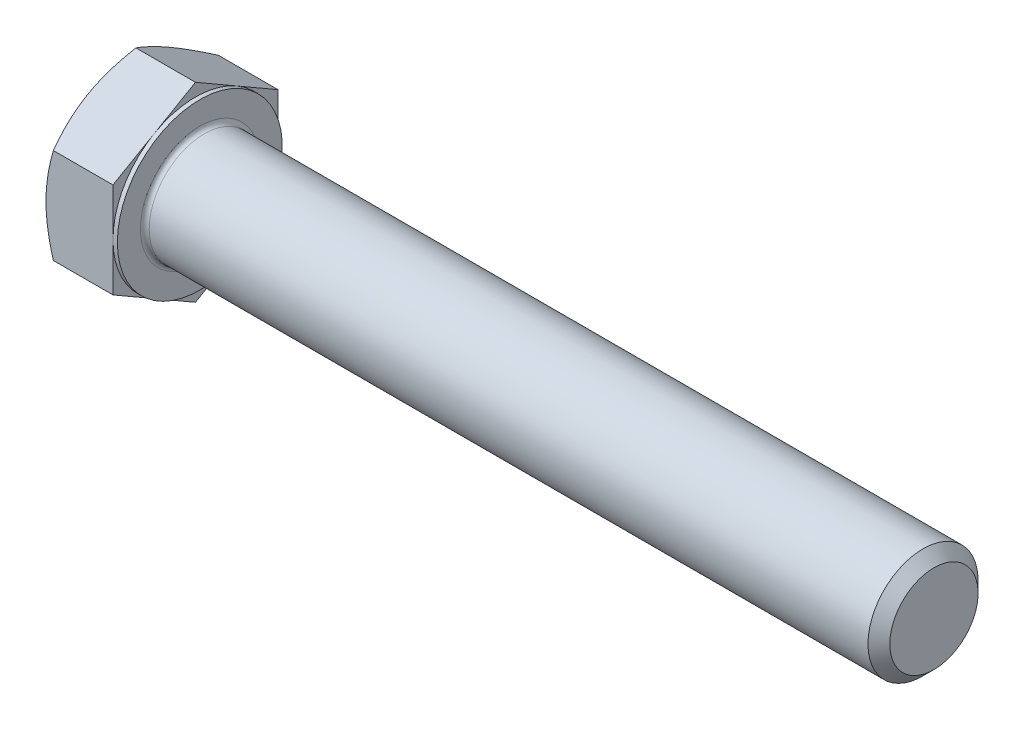
ISO-10303-21;
HEADER;
FILE_DESCRIPTION(('STEP AP214'),'2;1');
FILE_NAME('part.step','',(''),(''),'','','');
FILE_SCHEMA(('AUTOMOTIVE_DESIGN { 1 0 10303 214 1 1 1 1 }'));
ENDSEC;
DATA;
#1=APPLICATION_CONTEXT('core data for automotive mechanical design processes');
#2=APPLICATION_PROTOCOL_DEFINITION('international standard','automotive_design',2000,#1);
#3=PRODUCT_CONTEXT('',#1,'mechanical');
#4=PRODUCT('Part','Part','',(#3));
#5=PRODUCT_RELATED_PRODUCT_CATEGORY('part','',(#4));
#6=PRODUCT_DEFINITION_FORMATION('','',#4);
#7=PRODUCT_DEFINITION_CONTEXT('part definition',#1,'design');
#8=PRODUCT_DEFINITION('design','',#6,#7);
#9=PRODUCT_DEFINITION_SHAPE('','',#8);
#10=(LENGTH_UNIT() NAMED_UNIT(*) SI_UNIT(.MILLI.,.METRE.));
#11=(NAMED_UNIT(*) PLANE_ANGLE_UNIT() SI_UNIT($,.RADIAN.));
#12=(NAMED_UNIT(*) SI_UNIT($,.STERADIAN.) SOLID_ANGLE_UNIT());
#13=UNCERTAINTY_MEASURE_WITH_UNIT(LENGTH_MEASURE(1.E-05),#10,'distance_accuracy_value','');
#14=(GEOMETRIC_REPRESENTATION_CONTEXT(3) GLOBAL_UNCERTAINTY_ASSIGNED_CONTEXT((#13)) GLOBAL_UNIT_ASSIGNED_CONTEXT((#10,
#11,#12)) REPRESENTATION_CONTEXT('',''));
#15=CARTESIAN_POINT('',(0.,0.,0.));
#16=DIRECTION('',(0.,0.,1.));
#17=DIRECTION('',(1.,0.,0.));
#18=AXIS2_PLACEMENT_3D('',#15,#16,#17);
#19=CARTESIAN_POINT('',(0.,8.24155962262808,0.));
#20=DIRECTION('',(1.,0.,0.));
#21=DIRECTION('',(0.,0.,-1.));
#22=AXIS2_PLACEMENT_3D('',#19,#20,#21);
#23=PLANE('',#22);
#24=CARTESIAN_POINT('',(0.,0.,0.));
#25=DIRECTION('',(1.,0.,0.));
#26=DIRECTION('',(0.,1.,0.));
#27=AXIS2_PLACEMENT_3D('',#24,#25,#26);
#28=CIRCLE('',#27,7.1374);
#29=CARTESIAN_POINT('',(0.,-6.18116971697105,-3.56870000000001));
#30=VERTEX_POINT('',#29);
#31=CARTESIAN_POINT('',(0.,0.,-7.1374));
#32=VERTEX_POINT('',#31);
#33=EDGE_CURVE('E111',#30,#32,#28,.T.);
#34=ORIENTED_EDGE('',*,*,#33,.F.);
#35=CARTESIAN_POINT('',(0.,0.,0.));
#36=DIRECTION('',(1.,0.,0.));
#37=DIRECTION('',(0.,0.,-1.));
#38=AXIS2_PLACEMENT_3D('',#35,#36,#37);
#39=CIRCLE('',#38,7.1374);
#40=CARTESIAN_POINT('',(0.,-6.18116971697106,3.56870000000001));
#41=VERTEX_POINT('',#40);
#42=EDGE_CURVE('E108',#41,#30,#39,.T.);
#43=ORIENTED_EDGE('',*,*,#42,.F.);
#44=CARTESIAN_POINT('',(0.,0.,0.));
#45=DIRECTION('',(1.,0.,0.));
#46=DIRECTION('',(0.,0.,-1.));
#47=AXIS2_PLACEMENT_3D('',#44,#45,#46);
#48=CIRCLE('',#47,7.1374);
#49=CARTESIAN_POINT('',(0.,0.,7.1374));
#50=VERTEX_POINT('',#49);
#51=EDGE_CURVE('E423',#50,#41,#48,.T.);
#52=ORIENTED_EDGE('',*,*,#51,.F.);
#53=CARTESIAN_POINT('',(0.,0.,0.));
#54=DIRECTION('',(1.,0.,0.));
#55=DIRECTION('',(0.,0.,-1.));
#56=AXIS2_PLACEMENT_3D('',#53,#54,#55);
#57=CIRCLE('',#56,7.1374);
#58=CARTESIAN_POINT('',(0.,6.18116971697105,3.56870000000001));
#59=VERTEX_POINT('',#58);
#60=EDGE_CURVE('E169',#59,#50,#57,.T.);
#61=ORIENTED_EDGE('',*,*,#60,.F.);
#62=CARTESIAN_POINT('',(0.,0.,0.));
#63=DIRECTION('',(1.,0.,0.));
#64=DIRECTION('',(0.,0.,-1.));
#65=AXIS2_PLACEMENT_3D('',#62,#63,#64);
#66=CIRCLE('',#65,7.1374);
#67=CARTESIAN_POINT('',(0.,6.18116971697105,-3.56870000000001));
#68=VERTEX_POINT('',#67);
#69=EDGE_CURVE('E421',#68,#59,#66,.T.);
#70=ORIENTED_EDGE('',*,*,#69,.F.);
#71=CARTESIAN_POINT('',(0.,0.,0.));
#72=DIRECTION('',(1.,0.,0.));
#73=DIRECTION('',(0.,0.,-1.));
#74=AXIS2_PLACEMENT_3D('',#71,#72,#73);
#75=CIRCLE('',#74,7.1374);
#76=EDGE_CURVE('E114',#32,#68,#75,.T.);
#77=ORIENTED_EDGE('',*,*,#76,.F.);
#78=EDGE_LOOP('',(#34,#43,#52,#61,#70,#77));
#79=FACE_BOUND('',#78,.T.);
#80=ADVANCED_FACE('F14',(#79),#23,.F.);
#81=CARTESIAN_POINT('',(0.641311776484759,0.,0.));
#82=DIRECTION('',(1.,0.,0.));
#83=DIRECTION('',(0.,0.,-1.));
#84=AXIS2_PLACEMENT_3D('',#81,#82,#83);
#85=CONICAL_SURFACE('',#84,8.24818458036387,1.0471975511966);
#86=ORIENTED_EDGE('',*,*,#42,.T.);
#87=CARTESIAN_POINT('',(0.,-6.18116971697106,-3.56870000000002));
#88=CARTESIAN_POINT('',(-2.91702878282993E-05,-6.26862170985652,-3.41722870509925));
#89=CARTESIAN_POINT('',(0.00371114889844023,-6.35606948988297,-3.26576470708432));
#90=CARTESIAN_POINT('',(0.0185139577467834,-6.53079334497843,-2.9631341127647));
#91=CARTESIAN_POINT('',(0.0295749978503087,-6.61806945060963,-2.81196746352471));
#92=CARTESIAN_POINT('',(0.0587296036169502,-6.7918862225359,-2.5109079833408));
#93=CARTESIAN_POINT('',(0.0767877659737069,-6.87842838481195,-2.3610125612818));
#94=CARTESIAN_POINT('',(0.119548178265527,-7.05110039256495,-2.06193587080869));
#95=CARTESIAN_POINT('',(0.144250603082629,-7.13723022712836,-1.91275462129736));
#96=CARTESIAN_POINT('',(0.227561148311191,-7.39464422393007,-1.46690050025742));
#97=CARTESIAN_POINT('',(0.295412992760171,-7.56518058886256,-1.17152285165624));
#98=CARTESIAN_POINT('',(0.4518967007908,-7.90478678087675,-0.583307672522675));
#99=CARTESIAN_POINT('',(0.540632343376948,-8.07384476218822,-0.29049065946618));
#100=CARTESIAN_POINT('',(0.637486855352643,-8.2415596226281,0.));
#101=B_SPLINE_CURVE_WITH_KNOTS('',3,(#87,#88,#89,#90,#91,#92,#93,#94,#95,#96,#97,#98,#99,#100),
.UNSPECIFIED.,.F.,.F.,(4,2,2,2,2,2,4),(0.,0.524658409500519,1.04921296370403,1.5711473776056,
2.09309553056225,3.13562382142666,4.18344647054619),.UNSPECIFIED.);
#102=CARTESIAN_POINT('',(0.637486855352642,-8.2415596226281,0.));
#103=VERTEX_POINT('',#102);
#104=EDGE_CURVE('E126',#30,#103,#101,.T.);
#105=ORIENTED_EDGE('',*,*,#104,.T.);
#106=CARTESIAN_POINT('',(0.637486855352642,-8.2415596226281,0.));
#107=CARTESIAN_POINT('',(0.540632343376948,-8.07384476218822,0.290490659466181));
#108=CARTESIAN_POINT('',(0.451896700790801,-7.90478678087675,0.583307672522676));
#109=CARTESIAN_POINT('',(0.295412992760172,-7.56518058886257,1.17152285165624));
#110=CARTESIAN_POINT('',(0.227561148311191,-7.39464422393008,1.46690050025742));
#111=CARTESIAN_POINT('',(0.144250603082631,-7.13723022712836,1.91275462129736));
#112=CARTESIAN_POINT('',(0.119548178265529,-7.05110039256495,2.06193587080869));
#113=CARTESIAN_POINT('',(0.0767877659737091,-6.87842838481196,2.3610125612818));
#114=CARTESIAN_POINT('',(0.058729603616952,-6.7918862225359,2.5109079833408));
#115=CARTESIAN_POINT('',(0.0295749978503105,-6.61806945060963,2.81196746352471));
#116=CARTESIAN_POINT('',(0.0185139577467857,-6.53079334497843,2.9631341127647));
#117=CARTESIAN_POINT('',(0.00371114889844332,-6.35606948988298,3.26576470708432));
#118=CARTESIAN_POINT('',(-2.91702878249864E-05,-6.26862170985652,3.41722870509925));
#119=CARTESIAN_POINT('',(0.,-6.18116971697107,3.56870000000002));
#120=B_SPLINE_CURVE_WITH_KNOTS('',3,(#106,#107,#108,#109,#110,#111,#112,#113,#114,#115,#116,
#117,#118,#119),.UNSPECIFIED.,.F.,.F.,(4,2,2,2,2,2,4),(0.,1.04782264911953,2.09035093998394,
2.61229909294058,3.13423350684215,3.65878806104566,4.18344647054618),.UNSPECIFIED.);
#121=EDGE_CURVE('E132',#103,#41,#120,.T.);
#122=ORIENTED_EDGE('',*,*,#121,.T.);
#123=EDGE_LOOP('',(#86,#105,#122));
#124=FACE_BOUND('',#123,.T.);
#125=ADVANCED_FACE('F130',(#124),#85,.T.);
#126=CARTESIAN_POINT('',(0.641311776484747,0.,0.));
#127=DIRECTION('',(1.,0.,0.));
#128=DIRECTION('',(0.,1.,0.));
#129=AXIS2_PLACEMENT_3D('',#126,#127,#128);
#130=CONICAL_SURFACE('',#129,8.24818458036384,1.0471975511966);
#131=ORIENTED_EDGE('',*,*,#33,.T.);
#132=CARTESIAN_POINT('',(0.,0.,-7.1374));
#133=CARTESIAN_POINT('',(-2.91702878361616E-05,-0.174903985770917,-7.1374));
#134=CARTESIAN_POINT('',(0.00371114889843225,-0.349799545823828,-7.1374));
#135=CARTESIAN_POINT('',(0.0185139577467751,-0.699247256014727,-7.1374));
#136=CARTESIAN_POINT('',(0.0295749978503003,-0.873799467277128,-7.1374));
#137=CARTESIAN_POINT('',(0.0587296036169421,-1.22143301112966,-7.1374));
#138=CARTESIAN_POINT('',(0.0767877659736991,-1.39451733568178,-7.1374));
#139=CARTESIAN_POINT('',(0.119548178265519,-1.73986135118776,-7.1374));
#140=CARTESIAN_POINT('',(0.144250603082621,-1.91212102031459,-7.1374));
#141=CARTESIAN_POINT('',(0.227561148311181,-2.42694901391801,-7.1374));
#142=CARTESIAN_POINT('',(0.295412992760161,-2.76802174378299,-7.1374));
#143=CARTESIAN_POINT('',(0.45189670079079,-3.44723412781136,-7.1374));
#144=CARTESIAN_POINT('',(0.540632343376937,-3.7853500904343,-7.1374));
#145=CARTESIAN_POINT('',(0.637486855352632,-4.12077981131404,-7.1374));
#146=B_SPLINE_CURVE_WITH_KNOTS('',3,(#132,#133,#134,#135,#136,#137,#138,#139,#140,#141,#142,
#143,#144,#145),.UNSPECIFIED.,.F.,.F.,(4,2,2,2,2,2,4),(0.,0.524658409500517,1.04921296370403,
1.5711473776056,2.09309553056224,3.13562382142665,4.18344647054617),.UNSPECIFIED.);
#147=CARTESIAN_POINT('',(0.637486855352631,-4.12077981131404,-7.1374));
#148=VERTEX_POINT('',#147);
#149=EDGE_CURVE('E122',#32,#148,#146,.T.);
#150=ORIENTED_EDGE('',*,*,#149,.T.);
#151=CARTESIAN_POINT('',(0.637486855352631,-4.12077981131404,-7.1374));
#152=CARTESIAN_POINT('',(0.540632343376938,-4.28849467175391,-6.84690934053382));
#153=CARTESIAN_POINT('',(0.451896700790792,-4.45755265306538,-6.55409232747733));
#154=CARTESIAN_POINT('',(0.295412992760165,-4.79715884507957,-5.96587714834377));
#155=CARTESIAN_POINT('',(0.227561148311186,-4.96769521001206,-5.6704994997426));
#156=CARTESIAN_POINT('',(0.144250603082627,-5.22510920681377,-5.22464537870266));
#157=CARTESIAN_POINT('',(0.119548178265525,-5.31123904137718,-5.07546412919133));
#158=CARTESIAN_POINT('',(0.0767877659737055,-5.48391104913017,-4.77638743871822));
#159=CARTESIAN_POINT('',(0.0587296036169486,-5.57045321140623,-4.62649201665922));
#160=CARTESIAN_POINT('',(0.0295749978503076,-5.7442699833325,-4.32543253647531));
#161=CARTESIAN_POINT('',(0.0185139577467831,-5.8315460889637,-4.17426588723533));
#162=CARTESIAN_POINT('',(0.00371114889844103,-6.00626994405915,-3.87163529291571));
#163=CARTESIAN_POINT('',(-2.9170287827248E-05,-6.0937177240856,-3.72017129490078));
#164=CARTESIAN_POINT('',(0.,-6.18116971697106,-3.56870000000002));
#165=B_SPLINE_CURVE_WITH_KNOTS('',3,(#151,#152,#153,#154,#155,#156,#157,#158,#159,#160,#161,
#162,#163,#164),.UNSPECIFIED.,.F.,.F.,(4,2,2,2,2,2,4),(0.,1.04782264911952,2.09035093998392,
2.61229909294056,3.13423350684213,3.65878806104563,4.18344647054615),.UNSPECIFIED.);
#166=EDGE_CURVE('E120',#148,#30,#165,.T.);
#167=ORIENTED_EDGE('',*,*,#166,.T.);
#168=EDGE_LOOP('',(#131,#150,#167));
#169=FACE_BOUND('',#168,.T.);
#170=ADVANCED_FACE('F121',(#169),#130,.T.);
#171=CARTESIAN_POINT('',(0.641311776484744,0.,0.));
#172=DIRECTION('',(1.,0.,0.));
#173=DIRECTION('',(0.,0.,-1.));
#174=AXIS2_PLACEMENT_3D('',#171,#172,#173);
#175=CONICAL_SURFACE('',#174,8.24818458036384,1.0471975511966);
#176=CARTESIAN_POINT('',(0.637486855352629,4.12077981131404,-7.1374));
#177=CARTESIAN_POINT('',(0.540632343376935,3.7853500904343,-7.1374));
#178=CARTESIAN_POINT('',(0.451896700790788,3.44723412781136,-7.1374));
#179=CARTESIAN_POINT('',(0.29541299276016,2.76802174378299,-7.1374));
#180=CARTESIAN_POINT('',(0.22756114831118,2.42694901391801,-7.1374));
#181=CARTESIAN_POINT('',(0.14425060308262,1.91212102031458,-7.1374));
#182=CARTESIAN_POINT('',(0.119548178265518,1.73986135118776,-7.1374));
#183=CARTESIAN_POINT('',(0.0767877659736987,1.39451733568178,-7.1374));
#184=CARTESIAN_POINT('',(0.0587296036169421,1.22143301112966,-7.1374));
#185=CARTESIAN_POINT('',(0.0295749978503006,0.873799467277128,-7.1374));
#186=CARTESIAN_POINT('',(0.0185139577467753,0.699247256014728,-7.1374));
#187=CARTESIAN_POINT('',(0.00371114889843236,0.34979954582383,-7.1374));
#188=CARTESIAN_POINT('',(-2.91702878360451E-05,0.174903985770919,-7.1374));
#189=CARTESIAN_POINT('',(0.,0.,-7.1374));
#190=B_SPLINE_CURVE_WITH_KNOTS('',3,(#176,#177,#178,#179,#180,#181,#182,#183,#184,#185,#186,
#187,#188,#189),.UNSPECIFIED.,.F.,.F.,(4,2,2,2,2,2,4),(0.,1.04782264911952,2.09035093998393,
2.61229909294057,3.13423350684214,3.65878806104565,4.18344647054616),.UNSPECIFIED.);
#191=CARTESIAN_POINT('',(0.637486855352629,4.12077981131404,-7.1374));
#192=VERTEX_POINT('',#191);
#193=EDGE_CURVE('E140',#192,#32,#190,.T.);
#194=ORIENTED_EDGE('',*,*,#193,.T.);
#195=ORIENTED_EDGE('',*,*,#76,.T.);
#196=CARTESIAN_POINT('',(0.,6.18116971697105,-3.56870000000001));
#197=CARTESIAN_POINT('',(-2.91702878326612E-05,6.0937177240856,-3.72017129490077));
#198=CARTESIAN_POINT('',(0.0037111488984358,6.00626994405914,-3.8716352929157));
#199=CARTESIAN_POINT('',(0.0185139577467784,5.83154608896369,-4.17426588723532));
#200=CARTESIAN_POINT('',(0.0295749978503032,5.74426998333249,-4.32543253647531));
#201=CARTESIAN_POINT('',(0.0587296036169441,5.57045321140622,-4.62649201665922));
#202=CARTESIAN_POINT('',(0.0767877659737007,5.48391104913017,-4.77638743871822));
#203=CARTESIAN_POINT('',(0.11954817826552,5.31123904137718,-5.07546412919132));
#204=CARTESIAN_POINT('',(0.144250603082622,5.22510920681376,-5.22464537870265));
#205=CARTESIAN_POINT('',(0.227561148311182,4.96769521001205,-5.67049949974259));
#206=CARTESIAN_POINT('',(0.295412992760161,4.79715884507956,-5.96587714834377));
#207=CARTESIAN_POINT('',(0.451896700790789,4.45755265306538,-6.55409232747733));
#208=CARTESIAN_POINT('',(0.540632343376935,4.28849467175391,-6.84690934053382));
#209=CARTESIAN_POINT('',(0.637486855352629,4.12077981131404,-7.1374));
#210=B_SPLINE_CURVE_WITH_KNOTS('',3,(#196,#197,#198,#199,#200,#201,#202,#203,#204,#205,#206,
#207,#208,#209),.UNSPECIFIED.,.F.,.F.,(4,2,2,2,2,2,4),(0.,0.524658409500514,1.04921296370402,
1.57114737760559,2.09309553056223,3.13562382142663,4.18344647054615),.UNSPECIFIED.);
#211=EDGE_CURVE('E246',#68,#192,#210,.T.);
#212=ORIENTED_EDGE('',*,*,#211,.T.);
#213=EDGE_LOOP('',(#194,#195,#212));
#214=FACE_BOUND('',#213,.T.);
#215=ADVANCED_FACE('F236',(#214),#175,.T.);
#216=CARTESIAN_POINT('',(0.64131177648475,0.,0.));
#217=DIRECTION('',(1.,0.,0.));
#218=DIRECTION('',(0.,0.,-1.));
#219=AXIS2_PLACEMENT_3D('',#216,#217,#218);
#220=CONICAL_SURFACE('',#219,8.24818458036385,1.0471975511966);
#221=CARTESIAN_POINT('',(0.637486855352634,8.24155962262808,0.));
#222=CARTESIAN_POINT('',(0.54063234337694,8.07384476218821,-0.290490659466181));
#223=CARTESIAN_POINT('',(0.451896700790793,7.90478678087674,-0.583307672522675));
#224=CARTESIAN_POINT('',(0.295412992760164,7.56518058886255,-1.17152285165624));
#225=CARTESIAN_POINT('',(0.227561148311184,7.39464422393006,-1.46690050025742));
#226=CARTESIAN_POINT('',(0.144250603082623,7.13723022712835,-1.91275462129736));
#227=CARTESIAN_POINT('',(0.119548178265522,7.05110039256494,-2.06193587080869));
#228=CARTESIAN_POINT('',(0.0767877659737015,6.87842838481195,-2.3610125612818));
#229=CARTESIAN_POINT('',(0.0587296036169445,6.79188622253589,-2.5109079833408));
#230=CARTESIAN_POINT('',(0.029574997850303,6.61806945060962,-2.81196746352471));
#231=CARTESIAN_POINT('',(0.0185139577467781,6.53079334497842,-2.96313411276469));
#232=CARTESIAN_POINT('',(0.0037111488984355,6.35606948988297,-3.26576470708431));
#233=CARTESIAN_POINT('',(-2.91702878328936E-05,6.26862170985651,-3.41722870509924));
#234=CARTESIAN_POINT('',(0.,6.18116971697105,-3.56870000000001));
#235=B_SPLINE_CURVE_WITH_KNOTS('',3,(#221,#222,#223,#224,#225,#226,#227,#228,#229,#230,#231,
#232,#233,#234),.UNSPECIFIED.,.F.,.F.,(4,2,2,2,2,2,4),(0.,1.04782264911953,2.09035093998393,
2.61229909294057,3.13423350684215,3.65878806104566,4.18344647054617),.UNSPECIFIED.);
#236=CARTESIAN_POINT('',(0.637486855352634,8.24155962262808,0.));
#237=VERTEX_POINT('',#236);
#238=EDGE_CURVE('E241',#237,#68,#235,.T.);
#239=ORIENTED_EDGE('',*,*,#238,.T.);
#240=ORIENTED_EDGE('',*,*,#69,.T.);
#241=CARTESIAN_POINT('',(0.,6.18116971697105,3.56870000000001));
#242=CARTESIAN_POINT('',(-2.91702878348035E-05,6.26862170985651,3.41722870509924));
#243=CARTESIAN_POINT('',(0.00371114889843366,6.35606948988296,3.26576470708432));
#244=CARTESIAN_POINT('',(0.0185139577467761,6.53079334497841,2.9631341127647));
#245=CARTESIAN_POINT('',(0.0295749978503009,6.61806945060961,2.81196746352471));
#246=CARTESIAN_POINT('',(0.0587296036169423,6.79188622253588,2.5109079833408));
#247=CARTESIAN_POINT('',(0.0767877659736994,6.87842838481194,2.3610125612818));
#248=CARTESIAN_POINT('',(0.11954817826552,7.05110039256493,2.06193587080869));
#249=CARTESIAN_POINT('',(0.144250603082622,7.13723022712835,1.91275462129736));
#250=CARTESIAN_POINT('',(0.227561148311182,7.39464422393006,1.46690050025742));
#251=CARTESIAN_POINT('',(0.295412992760163,7.56518058886255,1.17152285165624));
#252=CARTESIAN_POINT('',(0.451896700790792,7.90478678087674,0.583307672522675));
#253=CARTESIAN_POINT('',(0.540632343376939,8.07384476218821,0.290490659466181));
#254=CARTESIAN_POINT('',(0.637486855352634,8.24155962262808,0.));
#255=B_SPLINE_CURVE_WITH_KNOTS('',3,(#241,#242,#243,#244,#245,#246,#247,#248,#249,#250,#251,
#252,#253,#254),.UNSPECIFIED.,.F.,.F.,(4,2,2,2,2,2,4),(0.,0.524658409500519,1.04921296370403,
1.5711473776056,2.09309553056224,3.13562382142665,4.18344647054618),.UNSPECIFIED.);
#256=EDGE_CURVE('E228',#59,#237,#255,.T.);
#257=ORIENTED_EDGE('',*,*,#256,.T.);
#258=EDGE_LOOP('',(#239,#240,#257));
#259=FACE_BOUND('',#258,.T.);
#260=ADVANCED_FACE('F233',(#259),#220,.T.);
#261=CARTESIAN_POINT('',(0.64131177648475,0.,0.));
#262=DIRECTION('',(1.,0.,0.));
#263=DIRECTION('',(0.,0.,-1.));
#264=AXIS2_PLACEMENT_3D('',#261,#262,#263);
#265=CONICAL_SURFACE('',#264,8.24818458036385,1.0471975511966);
#266=ORIENTED_EDGE('',*,*,#51,.T.);
#267=CARTESIAN_POINT('',(0.,-6.18116971697107,3.56870000000002));
#268=CARTESIAN_POINT('',(-2.91702878254666E-05,-6.09371772408561,3.72017129490078));
#269=CARTESIAN_POINT('',(0.00371114889844298,-6.00626994405915,3.87163529291571));
#270=CARTESIAN_POINT('',(0.0185139577467857,-5.8315460889637,4.17426588723533));
#271=CARTESIAN_POINT('',(0.0295749978503107,-5.7442699833325,4.32543253647531));
#272=CARTESIAN_POINT('',(0.0587296036169519,-5.57045321140624,4.62649201665922));
#273=CARTESIAN_POINT('',(0.0767877659737084,-5.48391104913018,4.77638743871822));
#274=CARTESIAN_POINT('',(0.119548178265528,-5.31123904137719,5.07546412919133));
#275=CARTESIAN_POINT('',(0.144250603082629,-5.22510920681378,5.22464537870266));
#276=CARTESIAN_POINT('',(0.227561148311189,-4.96769521001206,5.6704994997426));
#277=CARTESIAN_POINT('',(0.295412992760168,-4.79715884507957,5.96587714834377));
#278=CARTESIAN_POINT('',(0.451896700790795,-4.45755265306539,6.55409232747733));
#279=CARTESIAN_POINT('',(0.54063234337694,-4.28849467175392,6.84690934053382));
#280=CARTESIAN_POINT('',(0.637486855352634,-4.12077981131405,7.1374));
#281=B_SPLINE_CURVE_WITH_KNOTS('',3,(#267,#268,#269,#270,#271,#272,#273,#274,#275,#276,#277,
#278,#279,#280),.UNSPECIFIED.,.F.,.F.,(4,2,2,2,2,2,4),(0.,0.524658409500513,1.04921296370402,
1.57114737760559,2.09309553056223,3.13562382142663,4.18344647054615),.UNSPECIFIED.);
#282=CARTESIAN_POINT('',(0.637486855352634,-4.12077981131405,7.1374));
#283=VERTEX_POINT('',#282);
#284=EDGE_CURVE('E127',#41,#283,#281,.T.);
#285=ORIENTED_EDGE('',*,*,#284,.T.);
#286=CARTESIAN_POINT('',(0.637486855352634,-4.12077981131405,7.1374));
#287=CARTESIAN_POINT('',(0.540632343376939,-3.78535009043431,7.1374));
#288=CARTESIAN_POINT('',(0.451896700790792,-3.44723412781137,7.1374));
#289=CARTESIAN_POINT('',(0.295412992760163,-2.768021743783,7.1374));
#290=CARTESIAN_POINT('',(0.227561148311182,-2.42694901391802,7.1374));
#291=CARTESIAN_POINT('',(0.144250603082621,-1.91212102031459,7.1374));
#292=CARTESIAN_POINT('',(0.11954817826552,-1.73986135118776,7.1374));
#293=CARTESIAN_POINT('',(0.0767877659736995,-1.39451733568178,7.1374));
#294=CARTESIAN_POINT('',(0.0587296036169425,-1.22143301112967,7.1374));
#295=CARTESIAN_POINT('',(0.029574997850301,-0.873799467277129,7.1374));
#296=CARTESIAN_POINT('',(0.0185139577467761,-0.699247256014728,7.1374));
#297=CARTESIAN_POINT('',(0.0037111488984336,-0.349799545823828,7.1374));
#298=CARTESIAN_POINT('',(-2.91702878348108E-05,-0.174903985770916,7.1374));
#299=CARTESIAN_POINT('',(0.,0.,7.1374));
#300=B_SPLINE_CURVE_WITH_KNOTS('',3,(#286,#287,#288,#289,#290,#291,#292,#293,#294,#295,#296,
#297,#298,#299),.UNSPECIFIED.,.F.,.F.,(4,2,2,2,2,2,4),(0.,1.04782264911953,2.09035093998394,
2.61229909294058,3.13423350684215,3.65878806104566,4.18344647054618),.UNSPECIFIED.);
#301=EDGE_CURVE('E206',#283,#50,#300,.T.);
#302=ORIENTED_EDGE('',*,*,#301,.T.);
#303=EDGE_LOOP('',(#266,#285,#302));
#304=FACE_BOUND('',#303,.T.);
#305=ADVANCED_FACE('F184',(#304),#265,.T.);
#306=CARTESIAN_POINT('',(0.641311776484743,0.,0.));
#307=DIRECTION('',(1.,0.,0.));
#308=DIRECTION('',(0.,0.,-1.));
#309=AXIS2_PLACEMENT_3D('',#306,#307,#308);
#310=CONICAL_SURFACE('',#309,8.24818458036384,1.0471975511966);
#311=CARTESIAN_POINT('',(0.637486855352627,4.12077981131403,7.1374));
#312=CARTESIAN_POINT('',(0.540632343376934,4.2884946717539,6.84690934053382));
#313=CARTESIAN_POINT('',(0.451896700790787,4.45755265306537,6.55409232747733));
#314=CARTESIAN_POINT('',(0.295412992760159,4.79715884507955,5.96587714834377));
#315=CARTESIAN_POINT('',(0.227561148311179,4.96769521001204,5.67049949974259));
#316=CARTESIAN_POINT('',(0.14425060308262,5.22510920681376,5.22464537870266));
#317=CARTESIAN_POINT('',(0.119548178265519,5.31123904137717,5.07546412919132));
#318=CARTESIAN_POINT('',(0.0767877659736991,5.48391104913016,4.77638743871822));
#319=CARTESIAN_POINT('',(0.0587296036169418,5.57045321140622,4.62649201665922));
#320=CARTESIAN_POINT('',(0.0295749978503007,5.74426998333248,4.32543253647531));
#321=CARTESIAN_POINT('',(0.0185139577467763,5.83154608896368,4.17426588723533));
#322=CARTESIAN_POINT('',(0.00371114889843423,6.00626994405913,3.87163529291571));
#323=CARTESIAN_POINT('',(-2.91702878341603E-05,6.09371772408559,3.72017129490078));
#324=CARTESIAN_POINT('',(0.,6.18116971697105,3.56870000000001));
#325=B_SPLINE_CURVE_WITH_KNOTS('',3,(#311,#312,#313,#314,#315,#316,#317,#318,#319,#320,#321,
#322,#323,#324),.UNSPECIFIED.,.F.,.F.,(4,2,2,2,2,2,4),(0.,1.04782264911952,2.09035093998392,
2.61229909294056,3.13423350684213,3.65878806104564,4.18344647054615),.UNSPECIFIED.);
#326=CARTESIAN_POINT('',(0.637486855352627,4.12077981131403,7.1374));
#327=VERTEX_POINT('',#326);
#328=EDGE_CURVE('E190',#327,#59,#325,.T.);
#329=ORIENTED_EDGE('',*,*,#328,.T.);
#330=ORIENTED_EDGE('',*,*,#60,.T.);
#331=CARTESIAN_POINT('',(0.,0.,7.1374));
#332=CARTESIAN_POINT('',(-2.91702878348944E-05,0.174903985770917,7.1374));
#333=CARTESIAN_POINT('',(0.00371114889843349,0.349799545823827,7.1374));
#334=CARTESIAN_POINT('',(0.0185139577467759,0.699247256014725,7.1374));
#335=CARTESIAN_POINT('',(0.0295749978503006,0.873799467277125,7.1374));
#336=CARTESIAN_POINT('',(0.0587296036169419,1.22143301112966,7.1374));
#337=CARTESIAN_POINT('',(0.0767877659736988,1.39451733568177,7.1374));
#338=CARTESIAN_POINT('',(0.119548178265518,1.73986135118775,7.1374));
#339=CARTESIAN_POINT('',(0.14425060308262,1.91212102031458,7.1374));
#340=CARTESIAN_POINT('',(0.227561148311179,2.426949013918,7.1374));
#341=CARTESIAN_POINT('',(0.295412992760159,2.76802174378298,7.1374));
#342=CARTESIAN_POINT('',(0.451896700790787,3.44723412781135,7.1374));
#343=CARTESIAN_POINT('',(0.540632343376934,3.78535009043429,7.1374));
#344=CARTESIAN_POINT('',(0.637486855352627,4.12077981131403,7.1374));
#345=B_SPLINE_CURVE_WITH_KNOTS('',3,(#331,#332,#333,#334,#335,#336,#337,#338,#339,#340,#341,
#342,#343,#344),.UNSPECIFIED.,.F.,.F.,(4,2,2,2,2,2,4),(0.,0.524658409500514,1.04921296370402,
1.57114737760559,2.09309553056223,3.13562382142663,4.18344647054615),.UNSPECIFIED.);
#346=EDGE_CURVE('E198',#50,#327,#345,.T.);
#347=ORIENTED_EDGE('',*,*,#346,.T.);
#348=EDGE_LOOP('',(#329,#330,#347));
#349=FACE_BOUND('',#348,.T.);
#350=ADVANCED_FACE('F179',(#349),#310,.T.);
#351=CARTESIAN_POINT('',(6.1722,-8.2415596226281,0.));
#352=DIRECTION('',(0.,0.866025403784438,-0.500000000000001));
#353=DIRECTION('',(0.,0.500000000000001,0.866025403784438));
#354=AXIS2_PLACEMENT_3D('',#351,#352,#353);
#355=PLANE('',#354);
#356=DIRECTION('',(-1.,0.,0.));
#357=VECTOR('',#356,1.);
#358=CARTESIAN_POINT('',(6.1722,-4.12077981131405,7.1374));
#359=LINE('',#358,#357);
#360=CARTESIAN_POINT('',(5.7912,-4.12077981131405,7.1374));
#361=VERTEX_POINT('',#360);
#362=EDGE_CURVE('E357',#361,#283,#359,.T.);
#363=ORIENTED_EDGE('',*,*,#362,.T.);
#364=ORIENTED_EDGE('',*,*,#284,.F.);
#365=ORIENTED_EDGE('',*,*,#121,.F.);
#366=DIRECTION('',(1.,0.,0.));
#367=VECTOR('',#366,1.);
#368=CARTESIAN_POINT('',(6.1722,-8.2415596226281,0.));
#369=LINE('',#368,#367);
#370=CARTESIAN_POINT('',(5.7912,-8.2415596226281,0.));
#371=VERTEX_POINT('',#370);
#372=EDGE_CURVE('E138',#103,#371,#369,.T.);
#373=ORIENTED_EDGE('',*,*,#372,.T.);
#374=DIRECTION('',(0.,-0.500000000000005,-0.866025403784436));
#375=VECTOR('',#374,1.);
#376=CARTESIAN_POINT('',(5.7912,-6.18116971697105,3.5687));
#377=LINE('',#376,#375);
#378=CARTESIAN_POINT('',(5.7912,-6.18116971697105,3.5687));
#379=VERTEX_POINT('',#378);
#380=EDGE_CURVE('E347',#379,#371,#377,.T.);
#381=ORIENTED_EDGE('',*,*,#380,.F.);
#382=DIRECTION('',(0.,-0.499999999999996,-0.866025403784441));
#383=VECTOR('',#382,1.);
#384=CARTESIAN_POINT('',(5.7912,-4.12077981131405,7.1374));
#385=LINE('',#384,#383);
#386=EDGE_CURVE('E350',#361,#379,#385,.T.);
#387=ORIENTED_EDGE('',*,*,#386,.F.);
#388=EDGE_LOOP('',(#363,#364,#365,#373,#381,#387));
#389=FACE_BOUND('',#388,.T.);
#390=ADVANCED_FACE('F175',(#389),#355,.F.);
#391=CARTESIAN_POINT('',(6.1722,-4.12077981131404,-7.1374));
#392=DIRECTION('',(0.,0.866025403784438,0.500000000000001));
#393=DIRECTION('',(0.,-0.500000000000001,0.866025403784438));
#394=AXIS2_PLACEMENT_3D('',#391,#392,#393);
#395=PLANE('',#394);
#396=ORIENTED_EDGE('',*,*,#372,.F.);
#397=ORIENTED_EDGE('',*,*,#104,.F.);
#398=ORIENTED_EDGE('',*,*,#166,.F.);
#399=DIRECTION('',(1.,0.,0.));
#400=VECTOR('',#399,1.);
#401=CARTESIAN_POINT('',(6.1722,-4.12077981131404,-7.1374));
#402=LINE('',#401,#400);
#403=CARTESIAN_POINT('',(5.7912,-4.12077981131404,-7.1374));
#404=VERTEX_POINT('',#403);
#405=EDGE_CURVE('E247',#148,#404,#402,.T.);
#406=ORIENTED_EDGE('',*,*,#405,.T.);
#407=DIRECTION('',(0.,0.499999999999998,-0.866025403784439));
#408=VECTOR('',#407,1.);
#409=CARTESIAN_POINT('',(5.7912,-6.18116971697105,-3.56870000000001));
#410=LINE('',#409,#408);
#411=CARTESIAN_POINT('',(5.7912,-6.18116971697104,-3.56870000000001));
#412=VERTEX_POINT('',#411);
#413=EDGE_CURVE('E341',#412,#404,#410,.T.);
#414=ORIENTED_EDGE('',*,*,#413,.F.);
#415=DIRECTION('',(0.,0.500000000000005,-0.866025403784436));
#416=VECTOR('',#415,1.);
#417=CARTESIAN_POINT('',(5.7912,-8.2415596226281,0.));
#418=LINE('',#417,#416);
#419=EDGE_CURVE('E344',#371,#412,#418,.T.);
#420=ORIENTED_EDGE('',*,*,#419,.F.);
#421=EDGE_LOOP('',(#396,#397,#398,#406,#414,#420));
#422=FACE_BOUND('',#421,.T.);
#423=ADVANCED_FACE('F136',(#422),#395,.F.);
#424=CARTESIAN_POINT('',(6.1722,4.12077981131404,-7.1374));
#425=DIRECTION('',(0.,0.,1.));
#426=DIRECTION('',(0.,-1.,0.));
#427=AXIS2_PLACEMENT_3D('',#424,#425,#426);
#428=PLANE('',#427);
#429=ORIENTED_EDGE('',*,*,#405,.F.);
#430=ORIENTED_EDGE('',*,*,#149,.F.);
#431=ORIENTED_EDGE('',*,*,#193,.F.);
#432=DIRECTION('',(1.,0.,0.));
#433=VECTOR('',#432,1.);
#434=CARTESIAN_POINT('',(6.1722,4.12077981131404,-7.1374));
#435=LINE('',#434,#433);
#436=CARTESIAN_POINT('',(5.7912,4.12077981131404,-7.1374));
#437=VERTEX_POINT('',#436);
#438=EDGE_CURVE('E361',#192,#437,#435,.T.);
#439=ORIENTED_EDGE('',*,*,#438,.T.);
#440=DIRECTION('',(0.,1.,0.));
#441=VECTOR('',#440,1.);
#442=CARTESIAN_POINT('',(5.7912,7.1374,-7.1374));
#443=LINE('',#442,#441);
#444=CARTESIAN_POINT('',(5.7912,0.,-7.1374));
#445=VERTEX_POINT('',#444);
#446=EDGE_CURVE('E332',#445,#437,#443,.T.);
#447=ORIENTED_EDGE('',*,*,#446,.F.);
#448=DIRECTION('',(0.,1.,0.));
#449=VECTOR('',#448,1.);
#450=CARTESIAN_POINT('',(5.7912,7.1374,-7.1374));
#451=LINE('',#450,#449);
#452=EDGE_CURVE('E338',#404,#445,#451,.T.);
#453=ORIENTED_EDGE('',*,*,#452,.F.);
#454=EDGE_LOOP('',(#429,#430,#431,#439,#447,#453));
#455=FACE_BOUND('',#454,.T.);
#456=ADVANCED_FACE('F254',(#455),#428,.F.);
#457=CARTESIAN_POINT('',(6.1722,4.12077981131404,-7.1374));
#458=DIRECTION('',(0.,-0.866025403784438,0.500000000000001));
#459=DIRECTION('',(0.,-0.500000000000001,-0.866025403784438));
#460=AXIS2_PLACEMENT_3D('',#457,#458,#459);
#461=PLANE('',#460);
#462=ORIENTED_EDGE('',*,*,#438,.F.);
#463=ORIENTED_EDGE('',*,*,#211,.F.);
#464=ORIENTED_EDGE('',*,*,#238,.F.);
#465=DIRECTION('',(1.,0.,0.));
#466=VECTOR('',#465,1.);
#467=CARTESIAN_POINT('',(6.1722,8.24155962262808,0.));
#468=LINE('',#467,#466);
#469=CARTESIAN_POINT('',(5.7912,8.24155962262808,0.));
#470=VERTEX_POINT('',#469);
#471=EDGE_CURVE('E232',#237,#470,#468,.T.);
#472=ORIENTED_EDGE('',*,*,#471,.T.);
#473=DIRECTION('',(0.,0.500000000000002,0.866025403784437));
#474=VECTOR('',#473,1.);
#475=CARTESIAN_POINT('',(5.7912,6.18116971697105,-3.56870000000001));
#476=LINE('',#475,#474);
#477=CARTESIAN_POINT('',(5.7912,6.18116971697105,-3.5687));
#478=VERTEX_POINT('',#477);
#479=EDGE_CURVE('E329',#478,#470,#476,.T.);
#480=ORIENTED_EDGE('',*,*,#479,.F.);
#481=DIRECTION('',(0.,0.5,0.866025403784439));
#482=VECTOR('',#481,1.);
#483=CARTESIAN_POINT('',(5.7912,4.12077981131404,-7.1374));
#484=LINE('',#483,#482);
#485=EDGE_CURVE('E335',#437,#478,#484,.T.);
#486=ORIENTED_EDGE('',*,*,#485,.F.);
#487=EDGE_LOOP('',(#462,#463,#464,#472,#480,#486));
#488=FACE_BOUND('',#487,.T.);
#489=ADVANCED_FACE('F224',(#488),#461,.F.);
#490=CARTESIAN_POINT('',(6.1722,8.24155962262808,0.));
#491=DIRECTION('',(0.,-0.866025403784438,-0.500000000000001));
#492=DIRECTION('',(0.,0.500000000000001,-0.866025403784438));
#493=AXIS2_PLACEMENT_3D('',#490,#491,#492);
#494=PLANE('',#493);
#495=ORIENTED_EDGE('',*,*,#471,.F.);
#496=ORIENTED_EDGE('',*,*,#256,.F.);
#497=ORIENTED_EDGE('',*,*,#328,.F.);
#498=DIRECTION('',(-1.,0.,0.));
#499=VECTOR('',#498,1.);
#500=CARTESIAN_POINT('',(6.1722,4.12077981131403,7.1374));
#501=LINE('',#500,#499);
#502=CARTESIAN_POINT('',(5.7912,4.12077981131403,7.1374));
#503=VERTEX_POINT('',#502);
#504=EDGE_CURVE('E205',#327,#503,#501,.F.);
#505=ORIENTED_EDGE('',*,*,#504,.T.);
#506=DIRECTION('',(0.,-0.500000000000001,0.866025403784438));
#507=VECTOR('',#506,1.);
#508=CARTESIAN_POINT('',(5.7912,6.18116971697105,3.56870000000001));
#509=LINE('',#508,#507);
#510=CARTESIAN_POINT('',(5.7912,6.18116971697104,3.56870000000001));
#511=VERTEX_POINT('',#510);
#512=EDGE_CURVE('E323',#511,#503,#509,.T.);
#513=ORIENTED_EDGE('',*,*,#512,.F.);
#514=DIRECTION('',(0.,-0.500000000000002,0.866025403784438));
#515=VECTOR('',#514,1.);
#516=CARTESIAN_POINT('',(5.7912,8.24155962262808,0.));
#517=LINE('',#516,#515);
#518=EDGE_CURVE('E326',#470,#511,#517,.T.);
#519=ORIENTED_EDGE('',*,*,#518,.F.);
#520=EDGE_LOOP('',(#495,#496,#497,#505,#513,#519));
#521=FACE_BOUND('',#520,.T.);
#522=ADVANCED_FACE('F217',(#521),#494,.F.);
#523=CARTESIAN_POINT('',(6.1722,4.12077981131403,7.1374));
#524=DIRECTION('',(0.,0.,-1.));
#525=DIRECTION('',(-1.,0.,0.));
#526=AXIS2_PLACEMENT_3D('',#523,#524,#525);
#527=PLANE('',#526);
#528=ORIENTED_EDGE('',*,*,#504,.F.);
#529=ORIENTED_EDGE('',*,*,#346,.F.);
#530=ORIENTED_EDGE('',*,*,#301,.F.);
#531=ORIENTED_EDGE('',*,*,#362,.F.);
#532=DIRECTION('',(0.,1.,0.));
#533=VECTOR('',#532,1.);
#534=CARTESIAN_POINT('',(5.7912,7.1374,7.1374));
#535=LINE('',#534,#533);
#536=CARTESIAN_POINT('',(5.7912,0.,7.1374));
#537=VERTEX_POINT('',#536);
#538=EDGE_CURVE('E353',#537,#361,#535,.F.);
#539=ORIENTED_EDGE('',*,*,#538,.F.);
#540=DIRECTION('',(0.,1.,0.));
#541=VECTOR('',#540,1.);
#542=CARTESIAN_POINT('',(5.7912,7.1374,7.1374));
#543=LINE('',#542,#541);
#544=EDGE_CURVE('E315',#503,#537,#543,.F.);
#545=ORIENTED_EDGE('',*,*,#544,.F.);
#546=EDGE_LOOP('',(#528,#529,#530,#531,#539,#545));
#547=FACE_BOUND('',#546,.T.);
#548=ADVANCED_FACE('F212',(#547),#527,.F.);
#549=CARTESIAN_POINT('',(5.7912,7.1374,0.));
#550=DIRECTION('',(1.,0.,0.));
#551=DIRECTION('',(0.,0.,-1.));
#552=AXIS2_PLACEMENT_3D('',#549,#550,#551);
#553=PLANE('',#552);
#554=ORIENTED_EDGE('',*,*,#386,.T.);
#555=CARTESIAN_POINT('',(5.7912,0.,0.));
#556=DIRECTION('',(-1.,0.,0.));
#557=DIRECTION('',(0.,0.,1.));
#558=AXIS2_PLACEMENT_3D('',#555,#556,#557);
#559=CIRCLE('',#558,7.1374);
#560=EDGE_CURVE('E207',#537,#379,#559,.F.);
#561=ORIENTED_EDGE('',*,*,#560,.F.);
#562=ORIENTED_EDGE('',*,*,#538,.T.);
#563=EDGE_LOOP('',(#554,#561,#562));
#564=FACE_BOUND('',#563,.T.);
#565=ADVANCED_FACE('F216',(#564),#553,.T.);
#566=CARTESIAN_POINT('',(5.7912,7.1374,0.));
#567=DIRECTION('',(1.,0.,0.));
#568=DIRECTION('',(0.,0.,-1.));
#569=AXIS2_PLACEMENT_3D('',#566,#567,#568);
#570=PLANE('',#569);
#571=ORIENTED_EDGE('',*,*,#419,.T.);
#572=CARTESIAN_POINT('',(5.7912,0.,0.));
#573=DIRECTION('',(-1.,0.,0.));
#574=DIRECTION('',(0.,0.,1.));
#575=AXIS2_PLACEMENT_3D('',#572,#573,#574);
#576=CIRCLE('',#575,7.1374);
#577=EDGE_CURVE('E381',#379,#412,#576,.F.);
#578=ORIENTED_EDGE('',*,*,#577,.F.);
#579=ORIENTED_EDGE('',*,*,#380,.T.);
#580=EDGE_LOOP('',(#571,#578,#579));
#581=FACE_BOUND('',#580,.T.);
#582=ADVANCED_FACE('F401',(#581),#570,.T.);
#583=CARTESIAN_POINT('',(5.7912,7.1374,0.));
#584=DIRECTION('',(1.,0.,0.));
#585=DIRECTION('',(0.,0.,-1.));
#586=AXIS2_PLACEMENT_3D('',#583,#584,#585);
#587=PLANE('',#586);
#588=ORIENTED_EDGE('',*,*,#452,.T.);
#589=CARTESIAN_POINT('',(5.7912,0.,0.));
#590=DIRECTION('',(-1.,0.,0.));
#591=DIRECTION('',(0.,0.,1.));
#592=AXIS2_PLACEMENT_3D('',#589,#590,#591);
#593=CIRCLE('',#592,7.1374);
#594=EDGE_CURVE('E379',#412,#445,#593,.F.);
#595=ORIENTED_EDGE('',*,*,#594,.F.);
#596=ORIENTED_EDGE('',*,*,#413,.T.);
#597=EDGE_LOOP('',(#588,#595,#596));
#598=FACE_BOUND('',#597,.T.);
#599=ADVANCED_FACE('F404',(#598),#587,.T.);
#600=CARTESIAN_POINT('',(5.7912,7.1374,0.));
#601=DIRECTION('',(1.,0.,0.));
#602=DIRECTION('',(0.,0.,-1.));
#603=AXIS2_PLACEMENT_3D('',#600,#601,#602);
#604=PLANE('',#603);
#605=CARTESIAN_POINT('',(5.7912,0.,0.));
#606=DIRECTION('',(-1.,0.,0.));
#607=DIRECTION('',(0.,0.,1.));
#608=AXIS2_PLACEMENT_3D('',#605,#606,#607);
#609=CIRCLE('',#608,7.1374);
#610=EDGE_CURVE('E376',#445,#478,#609,.F.);
#611=ORIENTED_EDGE('',*,*,#610,.F.);
#612=ORIENTED_EDGE('',*,*,#446,.T.);
#613=ORIENTED_EDGE('',*,*,#485,.T.);
#614=EDGE_LOOP('',(#611,#612,#613));
#615=FACE_BOUND('',#614,.T.);
#616=ADVANCED_FACE('F408',(#615),#604,.T.);
#617=CARTESIAN_POINT('',(5.7912,7.1374,0.));
#618=DIRECTION('',(1.,0.,0.));
#619=DIRECTION('',(0.,0.,-1.));
#620=AXIS2_PLACEMENT_3D('',#617,#618,#619);
#621=PLANE('',#620);
#622=ORIENTED_EDGE('',*,*,#518,.T.);
#623=CARTESIAN_POINT('',(5.7912,0.,0.));
#624=DIRECTION('',(-1.,0.,0.));
#625=DIRECTION('',(0.,0.,1.));
#626=AXIS2_PLACEMENT_3D('',#623,#624,#625);
#627=CIRCLE('',#626,7.1374);
#628=EDGE_CURVE('E373',#478,#511,#627,.F.);
#629=ORIENTED_EDGE('',*,*,#628,.F.);
#630=ORIENTED_EDGE('',*,*,#479,.T.);
#631=EDGE_LOOP('',(#622,#629,#630));
#632=FACE_BOUND('',#631,.T.);
#633=ADVANCED_FACE('F413',(#632),#621,.T.);
#634=CARTESIAN_POINT('',(5.7912,7.1374,0.));
#635=DIRECTION('',(1.,0.,0.));
#636=DIRECTION('',(0.,0.,-1.));
#637=AXIS2_PLACEMENT_3D('',#634,#635,#636);
#638=PLANE('',#637);
#639=ORIENTED_EDGE('',*,*,#544,.T.);
#640=CARTESIAN_POINT('',(5.7912,0.,0.));
#641=DIRECTION('',(-1.,0.,0.));
#642=DIRECTION('',(0.,0.,1.));
#643=AXIS2_PLACEMENT_3D('',#640,#641,#642);
#644=CIRCLE('',#643,7.1374);
#645=EDGE_CURVE('E370',#511,#537,#644,.F.);
#646=ORIENTED_EDGE('',*,*,#645,.F.);
#647=ORIENTED_EDGE('',*,*,#512,.T.);
#648=EDGE_LOOP('',(#639,#646,#647));
#649=FACE_BOUND('',#648,.T.);
#650=ADVANCED_FACE('F394',(#649),#638,.T.);
#651=CARTESIAN_POINT('',(0.,0.,0.));
#652=DIRECTION('',(-1.,0.,0.));
#653=DIRECTION('',(0.,0.,1.));
#654=AXIS2_PLACEMENT_3D('',#651,#652,#653);
#655=CYLINDRICAL_SURFACE('',#654,7.1374);
#656=ORIENTED_EDGE('',*,*,#594,.T.);
#657=ORIENTED_EDGE('',*,*,#610,.T.);
#658=ORIENTED_EDGE('',*,*,#628,.T.);
#659=ORIENTED_EDGE('',*,*,#645,.T.);
#660=ORIENTED_EDGE('',*,*,#560,.T.);
#661=ORIENTED_EDGE('',*,*,#577,.T.);
#662=EDGE_LOOP('',(#656,#657,#658,#659,#660,#661));
#663=FACE_BOUND('',#662,.T.);
#664=CARTESIAN_POINT('',(6.1722,0.,0.));
#665=DIRECTION('',(-1.,0.,0.));
#666=DIRECTION('',(0.,0.,1.));
#667=AXIS2_PLACEMENT_3D('',#664,#665,#666);
#668=CIRCLE('',#667,7.1374);
#669=CARTESIAN_POINT('',(6.1722,0.,7.1374));
#670=VERTEX_POINT('',#669);
#671=EDGE_CURVE('E367',#670,#670,#668,.F.);
#672=ORIENTED_EDGE('',*,*,#671,.F.);
#673=EDGE_LOOP('',(#672));
#674=FACE_BOUND('',#673,.T.);
#675=ADVANCED_FACE('F387',(#663,#674),#655,.T.);
#676=CARTESIAN_POINT('',(69.6722,0.,0.));
#677=DIRECTION('',(-1.,0.,0.));
#678=DIRECTION('',(0.,0.,1.));
#679=AXIS2_PLACEMENT_3D('',#676,#677,#678);
#680=PLANE('',#679);
#681=CARTESIAN_POINT('',(69.6722000000136,0.,0.));
#682=DIRECTION('',(-1.,0.,0.));
#683=DIRECTION('',(0.,0.,1.));
#684=AXIS2_PLACEMENT_3D('',#681,#682,#683);
#685=CIRCLE('',#684,3.81635000007918);
#686=CARTESIAN_POINT('',(69.6722000000136,0.,3.81635000007918));
#687=VERTEX_POINT('',#686);
#688=EDGE_CURVE('E364',#687,#687,#685,.T.);
#689=ORIENTED_EDGE('',*,*,#688,.F.);
#690=EDGE_LOOP('',(#689));
#691=FACE_BOUND('',#690,.T.);
#692=ADVANCED_FACE('F299',(#691),#680,.F.);
#693=CARTESIAN_POINT('',(6.1722,8.24155962262808,0.));
#694=DIRECTION('',(1.,0.,0.));
#695=DIRECTION('',(0.,0.,-1.));
#696=AXIS2_PLACEMENT_3D('',#693,#694,#695);
#697=PLANE('',#696);
#698=ORIENTED_EDGE('',*,*,#671,.T.);
#699=EDGE_LOOP('',(#698));
#700=FACE_BOUND('',#699,.T.);
#701=CARTESIAN_POINT('',(6.1722,0.,0.));
#702=DIRECTION('',(1.,0.,0.));
#703=DIRECTION('',(0.,0.,1.));
#704=AXIS2_PLACEMENT_3D('',#701,#702,#703);
#705=CIRCLE('',#704,5.1435);
#706=CARTESIAN_POINT('',(6.1722,0.,-5.1435));
#707=VERTEX_POINT('',#706);
#708=CARTESIAN_POINT('',(6.1722,0.,5.1435));
#709=VERTEX_POINT('',#708);
#710=EDGE_CURVE('E286',#707,#709,#705,.F.);
#711=ORIENTED_EDGE('',*,*,#710,.T.);
#712=CARTESIAN_POINT('',(6.1722,0.,0.));
#713=DIRECTION('',(1.,0.,0.));
#714=DIRECTION('',(0.,0.,-1.));
#715=AXIS2_PLACEMENT_3D('',#712,#713,#714);
#716=CIRCLE('',#715,5.1435);
#717=EDGE_CURVE('E33',#709,#707,#716,.F.);
#718=ORIENTED_EDGE('',*,*,#717,.T.);
#719=EDGE_LOOP('',(#711,#718));
#720=FACE_BOUND('',#719,.T.);
#721=ADVANCED_FACE('F290',(#700,#720),#697,.T.);
#722=CARTESIAN_POINT('',(68.726050000123,0.,0.));
#723=DIRECTION('',(-1.,0.,0.));
#724=DIRECTION('',(0.,0.,1.));
#725=AXIS2_PLACEMENT_3D('',#722,#723,#724);
#726=CONICAL_SURFACE('',#725,4.76249999991296,0.785398163367409);
#727=CARTESIAN_POINT('',(68.72605,0.,0.));
#728=DIRECTION('',(-1.,0.,0.));
#729=DIRECTION('',(0.,0.,1.));
#730=AXIS2_PLACEMENT_3D('',#727,#728,#729);
#731=CIRCLE('',#730,4.7625);
#732=CARTESIAN_POINT('',(68.72605,0.,4.7625));
#733=VERTEX_POINT('',#732);
#734=EDGE_CURVE('E25',#733,#733,#731,.T.);
#735=ORIENTED_EDGE('',*,*,#734,.F.);
#736=EDGE_LOOP('',(#735));
#737=FACE_BOUND('',#736,.T.);
#738=ORIENTED_EDGE('',*,*,#688,.T.);
#739=EDGE_LOOP('',(#738));
#740=FACE_BOUND('',#739,.T.);
#741=ADVANCED_FACE('F273',(#737,#740),#726,.T.);
#742=CARTESIAN_POINT('',(6.5532,0.,0.));
#743=DIRECTION('',(1.,0.,0.));
#744=DIRECTION('',(0.,0.,-1.));
#745=AXIS2_PLACEMENT_3D('',#742,#743,#744);
#746=TOROIDAL_SURFACE('',#745,5.1435,0.381);
#747=CARTESIAN_POINT('',(6.5532,0.,0.));
#748=DIRECTION('',(-1.,0.,0.));
#749=DIRECTION('',(0.,0.,1.));
#750=AXIS2_PLACEMENT_3D('',#747,#748,#749);
#751=CIRCLE('',#750,4.7625);
#752=CARTESIAN_POINT('',(6.5532,0.,4.7625));
#753=VERTEX_POINT('',#752);
#754=EDGE_CURVE('E9',#753,#753,#751,.F.);
#755=ORIENTED_EDGE('',*,*,#754,.F.);
#756=EDGE_LOOP('',(#755));
#757=FACE_BOUND('',#756,.T.);
#758=ORIENTED_EDGE('',*,*,#710,.F.);
#759=ORIENTED_EDGE('',*,*,#717,.F.);
#760=EDGE_LOOP('',(#758,#759));
#761=FACE_BOUND('',#760,.T.);
#762=ADVANCED_FACE('F267',(#757,#761),#746,.F.);
#763=CARTESIAN_POINT('',(0.,0.,0.));
#764=DIRECTION('',(-1.,0.,0.));
#765=DIRECTION('',(0.,0.,1.));
#766=AXIS2_PLACEMENT_3D('',#763,#764,#765);
#767=CYLINDRICAL_SURFACE('',#766,4.7625);
#768=ORIENTED_EDGE('',*,*,#754,.T.);
#769=EDGE_LOOP('',(#768));
#770=FACE_BOUND('',#769,.T.);
#771=ORIENTED_EDGE('',*,*,#734,.T.);
#772=EDGE_LOOP('',(#771));
#773=FACE_BOUND('',#772,.T.);
#774=ADVANCED_FACE('F265',(#770,#773),#767,.T.);
#775=CLOSED_SHELL('',(#80,#125,#170,#215,#260,#305,#350,#390,#423,#456,#489,#522,#548,#565,#582,
#599,#616,#633,#650,#675,#692,#721,#741,#762,#774));
#776=MANIFOLD_SOLID_BREP('B1',#775);
#777=ADVANCED_BREP_SHAPE_REPRESENTATION('',(#18,#776),#14);
#778=SHAPE_DEFINITION_REPRESENTATION(#9,#777);
ENDSEC;
END-ISO-10303-21;
